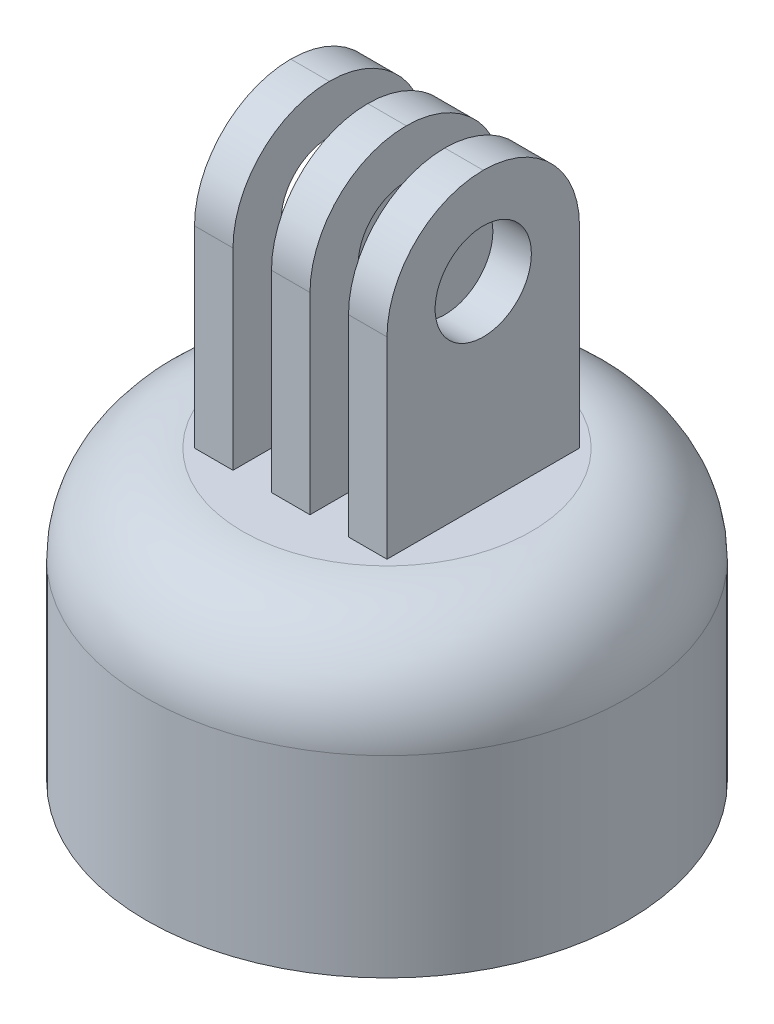
ISO-10303-21;
HEADER;
FILE_DESCRIPTION(('STEP AP214'),'2;1');
FILE_NAME('part.step','',(''),(''),'','','');
FILE_SCHEMA(('AUTOMOTIVE_DESIGN { 1 0 10303 214 1 1 1 1 }'));
ENDSEC;
DATA;
#1=APPLICATION_CONTEXT('core data for automotive mechanical design processes');
#2=APPLICATION_PROTOCOL_DEFINITION('international standard','automotive_design',2000,#1);
#3=PRODUCT_CONTEXT('',#1,'mechanical');
#4=PRODUCT('Part','Part','',(#3));
#5=PRODUCT_RELATED_PRODUCT_CATEGORY('part','',(#4));
#6=PRODUCT_DEFINITION_FORMATION('','',#4);
#7=PRODUCT_DEFINITION_CONTEXT('part definition',#1,'design');
#8=PRODUCT_DEFINITION('design','',#6,#7);
#9=PRODUCT_DEFINITION_SHAPE('','',#8);
#10=(LENGTH_UNIT() NAMED_UNIT(*) SI_UNIT(.MILLI.,.METRE.));
#11=(NAMED_UNIT(*) PLANE_ANGLE_UNIT() SI_UNIT($,.RADIAN.));
#12=(NAMED_UNIT(*) SI_UNIT($,.STERADIAN.) SOLID_ANGLE_UNIT());
#13=UNCERTAINTY_MEASURE_WITH_UNIT(LENGTH_MEASURE(1.E-05),#10,'distance_accuracy_value','');
#14=(GEOMETRIC_REPRESENTATION_CONTEXT(3) GLOBAL_UNCERTAINTY_ASSIGNED_CONTEXT((#13)) GLOBAL_UNIT_ASSIGNED_CONTEXT((#10,
#11,#12)) REPRESENTATION_CONTEXT('',''));
#15=CARTESIAN_POINT('',(0.,0.,0.));
#16=DIRECTION('',(0.,0.,1.));
#17=DIRECTION('',(1.,0.,0.));
#18=AXIS2_PLACEMENT_3D('',#15,#16,#17);
#19=CARTESIAN_POINT('',(0.,15.,0.));
#20=DIRECTION('',(0.,1.,0.));
#21=DIRECTION('',(0.,0.,1.));
#22=AXIS2_PLACEMENT_3D('',#19,#20,#21);
#23=PLANE('',#22);
#24=CARTESIAN_POINT('',(0.,15.,0.));
#25=DIRECTION('',(0.,1.,0.));
#26=DIRECTION('',(0.,0.,1.));
#27=AXIS2_PLACEMENT_3D('',#24,#25,#26);
#28=CIRCLE('',#27,7.5);
#29=CARTESIAN_POINT('',(0.,15.,7.5));
#30=VERTEX_POINT('',#29);
#31=EDGE_CURVE('E223',#30,#30,#28,.T.);
#32=ORIENTED_EDGE('',*,*,#31,.T.);
#33=EDGE_LOOP('',(#32));
#34=FACE_BOUND('',#33,.T.);
#35=DIRECTION('',(0.,0.,1.));
#36=VECTOR('',#35,1.);
#37=CARTESIAN_POINT('',(-1.,15.,5.));
#38=LINE('',#37,#36);
#39=CARTESIAN_POINT('',(-1.,15.,-5.));
#40=VERTEX_POINT('',#39);
#41=CARTESIAN_POINT('',(-1.,15.,5.));
#42=VERTEX_POINT('',#41);
#43=EDGE_CURVE('E194',#40,#42,#38,.T.);
#44=ORIENTED_EDGE('',*,*,#43,.F.);
#45=DIRECTION('',(-1.,0.,0.));
#46=VECTOR('',#45,1.);
#47=CARTESIAN_POINT('',(1.,15.,-5.));
#48=LINE('',#47,#46);
#49=CARTESIAN_POINT('',(1.,15.,-5.));
#50=VERTEX_POINT('',#49);
#51=EDGE_CURVE('E203',#50,#40,#48,.T.);
#52=ORIENTED_EDGE('',*,*,#51,.F.);
#53=DIRECTION('',(0.,0.,-1.));
#54=VECTOR('',#53,1.);
#55=CARTESIAN_POINT('',(1.,15.,5.));
#56=LINE('',#55,#54);
#57=CARTESIAN_POINT('',(1.,15.,5.));
#58=VERTEX_POINT('',#57);
#59=EDGE_CURVE('E200',#58,#50,#56,.T.);
#60=ORIENTED_EDGE('',*,*,#59,.F.);
#61=DIRECTION('',(1.,0.,0.));
#62=VECTOR('',#61,1.);
#63=CARTESIAN_POINT('',(1.,15.,5.));
#64=LINE('',#63,#62);
#65=EDGE_CURVE('E197',#42,#58,#64,.T.);
#66=ORIENTED_EDGE('',*,*,#65,.F.);
#67=EDGE_LOOP('',(#44,#52,#60,#66));
#68=FACE_BOUND('',#67,.T.);
#69=DIRECTION('',(1.,0.,0.));
#70=VECTOR('',#69,1.);
#71=CARTESIAN_POINT('',(5.,15.,5.));
#72=LINE('',#71,#70);
#73=CARTESIAN_POINT('',(3.,15.,5.));
#74=VERTEX_POINT('',#73);
#75=CARTESIAN_POINT('',(5.,15.,5.));
#76=VERTEX_POINT('',#75);
#77=EDGE_CURVE('E177',#74,#76,#72,.T.);
#78=ORIENTED_EDGE('',*,*,#77,.F.);
#79=DIRECTION('',(0.,0.,1.));
#80=VECTOR('',#79,1.);
#81=CARTESIAN_POINT('',(3.,15.,5.));
#82=LINE('',#81,#80);
#83=CARTESIAN_POINT('',(3.,15.,-5.));
#84=VERTEX_POINT('',#83);
#85=EDGE_CURVE('E150',#84,#74,#82,.T.);
#86=ORIENTED_EDGE('',*,*,#85,.F.);
#87=DIRECTION('',(-1.,0.,0.));
#88=VECTOR('',#87,1.);
#89=CARTESIAN_POINT('',(5.,15.,-5.));
#90=LINE('',#89,#88);
#91=CARTESIAN_POINT('',(5.,15.,-5.));
#92=VERTEX_POINT('',#91);
#93=EDGE_CURVE('E183',#92,#84,#90,.T.);
#94=ORIENTED_EDGE('',*,*,#93,.F.);
#95=DIRECTION('',(0.,0.,-1.));
#96=VECTOR('',#95,1.);
#97=CARTESIAN_POINT('',(5.,15.,5.));
#98=LINE('',#97,#96);
#99=EDGE_CURVE('E180',#76,#92,#98,.T.);
#100=ORIENTED_EDGE('',*,*,#99,.F.);
#101=EDGE_LOOP('',(#78,#86,#94,#100));
#102=FACE_BOUND('',#101,.T.);
#103=DIRECTION('',(1.,0.,0.));
#104=VECTOR('',#103,1.);
#105=CARTESIAN_POINT('',(-3.,15.,5.00000000000003));
#106=LINE('',#105,#104);
#107=CARTESIAN_POINT('',(-5.,15.,5.00000000000003));
#108=VERTEX_POINT('',#107);
#109=CARTESIAN_POINT('',(-3.,15.,5.00000000000003));
#110=VERTEX_POINT('',#109);
#111=EDGE_CURVE('E144',#108,#110,#106,.T.);
#112=ORIENTED_EDGE('',*,*,#111,.F.);
#113=DIRECTION('',(0.,0.,1.));
#114=VECTOR('',#113,1.);
#115=CARTESIAN_POINT('',(-5.,15.,5.00000000000003));
#116=LINE('',#115,#114);
#117=CARTESIAN_POINT('',(-5.,15.,-4.99999999999997));
#118=VERTEX_POINT('',#117);
#119=EDGE_CURVE('E154',#118,#108,#116,.T.);
#120=ORIENTED_EDGE('',*,*,#119,.F.);
#121=DIRECTION('',(-1.,0.,0.));
#122=VECTOR('',#121,1.);
#123=CARTESIAN_POINT('',(-3.,15.,-4.99999999999997));
#124=LINE('',#123,#122);
#125=CARTESIAN_POINT('',(-3.,15.,-4.99999999999997));
#126=VERTEX_POINT('',#125);
#127=EDGE_CURVE('E166',#126,#118,#124,.T.);
#128=ORIENTED_EDGE('',*,*,#127,.F.);
#129=DIRECTION('',(0.,0.,-1.));
#130=VECTOR('',#129,1.);
#131=CARTESIAN_POINT('',(-3.,15.,5.00000000000003));
#132=LINE('',#131,#130);
#133=EDGE_CURVE('E164',#110,#126,#132,.T.);
#134=ORIENTED_EDGE('',*,*,#133,.F.);
#135=EDGE_LOOP('',(#112,#120,#128,#134));
#136=FACE_BOUND('',#135,.T.);
#137=ADVANCED_FACE('F33',(#34,#68,#102,#136),#23,.T.);
#138=CARTESIAN_POINT('',(0.,0.,0.));
#139=DIRECTION('',(0.,1.,0.));
#140=DIRECTION('',(0.,0.,1.));
#141=AXIS2_PLACEMENT_3D('',#138,#139,#140);
#142=PLANE('',#141);
#143=CARTESIAN_POINT('',(0.,0.,0.));
#144=DIRECTION('',(0.,1.,0.));
#145=DIRECTION('',(0.,0.,1.));
#146=AXIS2_PLACEMENT_3D('',#143,#144,#145);
#147=CIRCLE('',#146,12.5);
#148=CARTESIAN_POINT('',(0.,0.,12.5));
#149=VERTEX_POINT('',#148);
#150=EDGE_CURVE('E220',#149,#149,#147,.T.);
#151=ORIENTED_EDGE('',*,*,#150,.F.);
#152=EDGE_LOOP('',(#151));
#153=FACE_BOUND('',#152,.T.);
#154=CARTESIAN_POINT('',(0.,0.,0.));
#155=DIRECTION('',(0.,1.,0.));
#156=DIRECTION('',(0.,0.,1.));
#157=AXIS2_PLACEMENT_3D('',#154,#155,#156);
#158=CIRCLE('',#157,10.5);
#159=CARTESIAN_POINT('',(0.,0.,10.5));
#160=VERTEX_POINT('',#159);
#161=EDGE_CURVE('E217',#160,#160,#158,.T.);
#162=ORIENTED_EDGE('',*,*,#161,.T.);
#163=EDGE_LOOP('',(#162));
#164=FACE_BOUND('',#163,.T.);
#165=ADVANCED_FACE('F316',(#153,#164),#142,.F.);
#166=CARTESIAN_POINT('',(0.,10.,0.));
#167=DIRECTION('',(0.,-1.,0.));
#168=DIRECTION('',(0.,0.,-1.));
#169=AXIS2_PLACEMENT_3D('',#166,#167,#168);
#170=CYLINDRICAL_SURFACE('',#169,12.5);
#171=CARTESIAN_POINT('',(0.,10.,0.));
#172=DIRECTION('',(0.,1.,0.));
#173=DIRECTION('',(0.,0.,1.));
#174=AXIS2_PLACEMENT_3D('',#171,#172,#173);
#175=CIRCLE('',#174,12.5);
#176=CARTESIAN_POINT('',(0.,10.,12.5));
#177=VERTEX_POINT('',#176);
#178=EDGE_CURVE('E226',#177,#177,#175,.F.);
#179=ORIENTED_EDGE('',*,*,#178,.T.);
#180=EDGE_LOOP('',(#179));
#181=FACE_BOUND('',#180,.T.);
#182=ORIENTED_EDGE('',*,*,#150,.T.);
#183=EDGE_LOOP('',(#182));
#184=FACE_BOUND('',#183,.T.);
#185=ADVANCED_FACE('F322',(#181,#184),#170,.T.);
#186=CARTESIAN_POINT('',(0.,10.,0.));
#187=DIRECTION('',(0.,-1.,0.));
#188=DIRECTION('',(0.,0.,-1.));
#189=AXIS2_PLACEMENT_3D('',#186,#187,#188);
#190=CYLINDRICAL_SURFACE('',#189,10.5);
#191=CARTESIAN_POINT('',(0.,10.,0.));
#192=DIRECTION('',(0.,1.,0.));
#193=DIRECTION('',(0.,0.,1.));
#194=AXIS2_PLACEMENT_3D('',#191,#192,#193);
#195=CIRCLE('',#194,10.5);
#196=CARTESIAN_POINT('',(0.,10.,10.5));
#197=VERTEX_POINT('',#196);
#198=EDGE_CURVE('E214',#197,#197,#195,.T.);
#199=ORIENTED_EDGE('',*,*,#198,.T.);
#200=EDGE_LOOP('',(#199));
#201=FACE_BOUND('',#200,.T.);
#202=ORIENTED_EDGE('',*,*,#161,.F.);
#203=EDGE_LOOP('',(#202));
#204=FACE_BOUND('',#203,.T.);
#205=ADVANCED_FACE('F333',(#201,#204),#190,.F.);
#206=CARTESIAN_POINT('',(0.,10.,0.));
#207=DIRECTION('',(0.,1.,0.));
#208=DIRECTION('',(0.,0.,1.));
#209=AXIS2_PLACEMENT_3D('',#206,#207,#208);
#210=PLANE('',#209);
#211=ORIENTED_EDGE('',*,*,#198,.F.);
#212=EDGE_LOOP('',(#211));
#213=FACE_BOUND('',#212,.T.);
#214=ADVANCED_FACE('F330',(#213),#210,.F.);
#215=CARTESIAN_POINT('',(-1.,30.,5.));
#216=DIRECTION('',(1.,0.,0.));
#217=DIRECTION('',(0.,0.,-1.));
#218=AXIS2_PLACEMENT_3D('',#215,#216,#217);
#219=PLANE('',#218);
#220=CARTESIAN_POINT('',(-1.,25.,0.));
#221=DIRECTION('',(1.,0.,0.));
#222=DIRECTION('',(0.,0.,-1.));
#223=AXIS2_PLACEMENT_3D('',#220,#221,#222);
#224=CIRCLE('',#223,2.5);
#225=CARTESIAN_POINT('',(-1.,25.,-2.5));
#226=VERTEX_POINT('',#225);
#227=EDGE_CURVE('E268',#226,#226,#224,.T.);
#228=ORIENTED_EDGE('',*,*,#227,.T.);
#229=EDGE_LOOP('',(#228));
#230=FACE_BOUND('',#229,.T.);
#231=CARTESIAN_POINT('',(-1.,25.,0.));
#232=DIRECTION('',(1.,0.,0.));
#233=DIRECTION('',(0.,0.,-1.));
#234=AXIS2_PLACEMENT_3D('',#231,#232,#233);
#235=CIRCLE('',#234,5.);
#236=CARTESIAN_POINT('',(-1.,25.,5.));
#237=VERTEX_POINT('',#236);
#238=CARTESIAN_POINT('',(-1.,30.,0.));
#239=VERTEX_POINT('',#238);
#240=EDGE_CURVE('E240',#237,#239,#235,.F.);
#241=ORIENTED_EDGE('',*,*,#240,.T.);
#242=CARTESIAN_POINT('',(-1.,25.,0.));
#243=DIRECTION('',(1.,0.,0.));
#244=DIRECTION('',(0.,0.,-1.));
#245=AXIS2_PLACEMENT_3D('',#242,#243,#244);
#246=CIRCLE('',#245,5.);
#247=CARTESIAN_POINT('',(-1.,25.,-5.));
#248=VERTEX_POINT('',#247);
#249=EDGE_CURVE('E242',#239,#248,#246,.F.);
#250=ORIENTED_EDGE('',*,*,#249,.T.);
#251=DIRECTION('',(0.,-1.,0.));
#252=VECTOR('',#251,1.);
#253=CARTESIAN_POINT('',(-1.,30.,-5.));
#254=LINE('',#253,#252);
#255=EDGE_CURVE('E206',#248,#40,#254,.T.);
#256=ORIENTED_EDGE('',*,*,#255,.T.);
#257=ORIENTED_EDGE('',*,*,#43,.T.);
#258=DIRECTION('',(0.,-1.,0.));
#259=VECTOR('',#258,1.);
#260=CARTESIAN_POINT('',(-1.,30.,5.));
#261=LINE('',#260,#259);
#262=EDGE_CURVE('E212',#237,#42,#261,.T.);
#263=ORIENTED_EDGE('',*,*,#262,.F.);
#264=EDGE_LOOP('',(#241,#250,#256,#257,#263));
#265=FACE_BOUND('',#264,.T.);
#266=ADVANCED_FACE('F328',(#230,#265),#219,.F.);
#267=CARTESIAN_POINT('',(1.,30.,5.));
#268=DIRECTION('',(0.,0.,-1.));
#269=DIRECTION('',(-1.,0.,0.));
#270=AXIS2_PLACEMENT_3D('',#267,#268,#269);
#271=PLANE('',#270);
#272=DIRECTION('',(0.,-1.,0.));
#273=VECTOR('',#272,1.);
#274=CARTESIAN_POINT('',(1.,30.,5.));
#275=LINE('',#274,#273);
#276=CARTESIAN_POINT('',(1.,25.,5.));
#277=VERTEX_POINT('',#276);
#278=EDGE_CURVE('E210',#277,#58,#275,.T.);
#279=ORIENTED_EDGE('',*,*,#278,.F.);
#280=DIRECTION('',(1.,0.,0.));
#281=VECTOR('',#280,1.);
#282=CARTESIAN_POINT('',(-1.,25.,5.));
#283=LINE('',#282,#281);
#284=EDGE_CURVE('E42',#277,#237,#283,.F.);
#285=ORIENTED_EDGE('',*,*,#284,.T.);
#286=ORIENTED_EDGE('',*,*,#262,.T.);
#287=ORIENTED_EDGE('',*,*,#65,.T.);
#288=EDGE_LOOP('',(#279,#285,#286,#287));
#289=FACE_BOUND('',#288,.T.);
#290=ADVANCED_FACE('F397',(#289),#271,.F.);
#291=CARTESIAN_POINT('',(1.,30.,5.));
#292=DIRECTION('',(-1.,0.,0.));
#293=DIRECTION('',(0.,0.,1.));
#294=AXIS2_PLACEMENT_3D('',#291,#292,#293);
#295=PLANE('',#294);
#296=CARTESIAN_POINT('',(0.999999999999999,25.,0.));
#297=DIRECTION('',(-1.,0.,0.));
#298=DIRECTION('',(0.,0.,1.));
#299=AXIS2_PLACEMENT_3D('',#296,#297,#298);
#300=CIRCLE('',#299,2.5);
#301=CARTESIAN_POINT('',(0.999999999999999,25.,2.5));
#302=VERTEX_POINT('',#301);
#303=EDGE_CURVE('E273',#302,#302,#300,.T.);
#304=ORIENTED_EDGE('',*,*,#303,.T.);
#305=EDGE_LOOP('',(#304));
#306=FACE_BOUND('',#305,.T.);
#307=DIRECTION('',(0.,-1.,0.));
#308=VECTOR('',#307,1.);
#309=CARTESIAN_POINT('',(1.,30.,-5.));
#310=LINE('',#309,#308);
#311=CARTESIAN_POINT('',(1.,25.,-5.));
#312=VERTEX_POINT('',#311);
#313=EDGE_CURVE('E208',#312,#50,#310,.T.);
#314=ORIENTED_EDGE('',*,*,#313,.F.);
#315=CARTESIAN_POINT('',(1.,25.,0.));
#316=DIRECTION('',(-1.,0.,0.));
#317=DIRECTION('',(0.,0.,1.));
#318=AXIS2_PLACEMENT_3D('',#315,#316,#317);
#319=CIRCLE('',#318,5.);
#320=CARTESIAN_POINT('',(1.,30.,0.));
#321=VERTEX_POINT('',#320);
#322=EDGE_CURVE('E249',#312,#321,#319,.F.);
#323=ORIENTED_EDGE('',*,*,#322,.T.);
#324=CARTESIAN_POINT('',(1.,25.,0.));
#325=DIRECTION('',(-1.,0.,0.));
#326=DIRECTION('',(0.,0.,1.));
#327=AXIS2_PLACEMENT_3D('',#324,#325,#326);
#328=CIRCLE('',#327,5.);
#329=EDGE_CURVE('E247',#321,#277,#328,.F.);
#330=ORIENTED_EDGE('',*,*,#329,.T.);
#331=ORIENTED_EDGE('',*,*,#278,.T.);
#332=ORIENTED_EDGE('',*,*,#59,.T.);
#333=EDGE_LOOP('',(#314,#323,#330,#331,#332));
#334=FACE_BOUND('',#333,.T.);
#335=ADVANCED_FACE('F394',(#306,#334),#295,.F.);
#336=CARTESIAN_POINT('',(1.,30.,-5.));
#337=DIRECTION('',(0.,0.,1.));
#338=DIRECTION('',(1.,0.,0.));
#339=AXIS2_PLACEMENT_3D('',#336,#337,#338);
#340=PLANE('',#339);
#341=ORIENTED_EDGE('',*,*,#255,.F.);
#342=DIRECTION('',(-1.,0.,0.));
#343=VECTOR('',#342,1.);
#344=CARTESIAN_POINT('',(1.,25.,-5.));
#345=LINE('',#344,#343);
#346=EDGE_CURVE('E244',#248,#312,#345,.F.);
#347=ORIENTED_EDGE('',*,*,#346,.T.);
#348=ORIENTED_EDGE('',*,*,#313,.T.);
#349=ORIENTED_EDGE('',*,*,#51,.T.);
#350=EDGE_LOOP('',(#341,#347,#348,#349));
#351=FACE_BOUND('',#350,.T.);
#352=ADVANCED_FACE('F388',(#351),#340,.F.);
#353=CARTESIAN_POINT('',(3.,30.,5.));
#354=DIRECTION('',(1.,0.,0.));
#355=DIRECTION('',(0.,0.,-1.));
#356=AXIS2_PLACEMENT_3D('',#353,#354,#355);
#357=PLANE('',#356);
#358=CARTESIAN_POINT('',(3.,25.,0.));
#359=DIRECTION('',(1.,0.,0.));
#360=DIRECTION('',(0.,0.,-1.));
#361=AXIS2_PLACEMENT_3D('',#358,#359,#360);
#362=CIRCLE('',#361,2.5);
#363=CARTESIAN_POINT('',(3.,25.,-2.5));
#364=VERTEX_POINT('',#363);
#365=EDGE_CURVE('E277',#364,#364,#362,.T.);
#366=ORIENTED_EDGE('',*,*,#365,.T.);
#367=EDGE_LOOP('',(#366));
#368=FACE_BOUND('',#367,.T.);
#369=CARTESIAN_POINT('',(3.,25.,0.));
#370=DIRECTION('',(1.,0.,0.));
#371=DIRECTION('',(0.,0.,-1.));
#372=AXIS2_PLACEMENT_3D('',#369,#370,#371);
#373=CIRCLE('',#372,5.);
#374=CARTESIAN_POINT('',(3.,25.,5.));
#375=VERTEX_POINT('',#374);
#376=CARTESIAN_POINT('',(3.,30.,0.));
#377=VERTEX_POINT('',#376);
#378=EDGE_CURVE('E251',#375,#377,#373,.F.);
#379=ORIENTED_EDGE('',*,*,#378,.T.);
#380=CARTESIAN_POINT('',(3.,25.,0.));
#381=DIRECTION('',(1.,0.,0.));
#382=DIRECTION('',(0.,0.,-1.));
#383=AXIS2_PLACEMENT_3D('',#380,#381,#382);
#384=CIRCLE('',#383,5.);
#385=CARTESIAN_POINT('',(3.,25.,-5.));
#386=VERTEX_POINT('',#385);
#387=EDGE_CURVE('E253',#377,#386,#384,.F.);
#388=ORIENTED_EDGE('',*,*,#387,.T.);
#389=DIRECTION('',(0.,-1.,0.));
#390=VECTOR('',#389,1.);
#391=CARTESIAN_POINT('',(3.,30.,-5.));
#392=LINE('',#391,#390);
#393=EDGE_CURVE('E186',#386,#84,#392,.T.);
#394=ORIENTED_EDGE('',*,*,#393,.T.);
#395=ORIENTED_EDGE('',*,*,#85,.T.);
#396=DIRECTION('',(0.,-1.,0.));
#397=VECTOR('',#396,1.);
#398=CARTESIAN_POINT('',(3.,30.,5.));
#399=LINE('',#398,#397);
#400=EDGE_CURVE('E192',#375,#74,#399,.T.);
#401=ORIENTED_EDGE('',*,*,#400,.F.);
#402=EDGE_LOOP('',(#379,#388,#394,#395,#401));
#403=FACE_BOUND('',#402,.T.);
#404=ADVANCED_FACE('F375',(#368,#403),#357,.F.);
#405=CARTESIAN_POINT('',(5.,30.,5.));
#406=DIRECTION('',(0.,0.,-1.));
#407=DIRECTION('',(-1.,0.,0.));
#408=AXIS2_PLACEMENT_3D('',#405,#406,#407);
#409=PLANE('',#408);
#410=DIRECTION('',(0.,-1.,0.));
#411=VECTOR('',#410,1.);
#412=CARTESIAN_POINT('',(5.,30.,5.));
#413=LINE('',#412,#411);
#414=CARTESIAN_POINT('',(5.,25.,5.));
#415=VERTEX_POINT('',#414);
#416=EDGE_CURVE('E190',#415,#76,#413,.T.);
#417=ORIENTED_EDGE('',*,*,#416,.F.);
#418=DIRECTION('',(1.,0.,0.));
#419=VECTOR('',#418,1.);
#420=CARTESIAN_POINT('',(3.,25.,5.));
#421=LINE('',#420,#419);
#422=EDGE_CURVE('E11',#415,#375,#421,.F.);
#423=ORIENTED_EDGE('',*,*,#422,.T.);
#424=ORIENTED_EDGE('',*,*,#400,.T.);
#425=ORIENTED_EDGE('',*,*,#77,.T.);
#426=EDGE_LOOP('',(#417,#423,#424,#425));
#427=FACE_BOUND('',#426,.T.);
#428=ADVANCED_FACE('F379',(#427),#409,.F.);
#429=CARTESIAN_POINT('',(5.,30.,5.));
#430=DIRECTION('',(-1.,0.,0.));
#431=DIRECTION('',(0.,0.,1.));
#432=AXIS2_PLACEMENT_3D('',#429,#430,#431);
#433=PLANE('',#432);
#434=CARTESIAN_POINT('',(5.,25.,0.));
#435=DIRECTION('',(1.,0.,0.));
#436=DIRECTION('',(0.,0.,-1.));
#437=AXIS2_PLACEMENT_3D('',#434,#435,#436);
#438=CIRCLE('',#437,2.5);
#439=CARTESIAN_POINT('',(5.,25.,-2.5));
#440=VERTEX_POINT('',#439);
#441=EDGE_CURVE('E285',#440,#440,#438,.T.);
#442=ORIENTED_EDGE('',*,*,#441,.F.);
#443=EDGE_LOOP('',(#442));
#444=FACE_BOUND('',#443,.T.);
#445=DIRECTION('',(0.,-1.,0.));
#446=VECTOR('',#445,1.);
#447=CARTESIAN_POINT('',(5.,30.,-5.));
#448=LINE('',#447,#446);
#449=CARTESIAN_POINT('',(5.,25.,-5.));
#450=VERTEX_POINT('',#449);
#451=EDGE_CURVE('E188',#450,#92,#448,.T.);
#452=ORIENTED_EDGE('',*,*,#451,.F.);
#453=CARTESIAN_POINT('',(5.,25.,0.));
#454=DIRECTION('',(-1.,0.,0.));
#455=DIRECTION('',(0.,0.,1.));
#456=AXIS2_PLACEMENT_3D('',#453,#454,#455);
#457=CIRCLE('',#456,5.);
#458=CARTESIAN_POINT('',(5.,30.,0.));
#459=VERTEX_POINT('',#458);
#460=EDGE_CURVE('E55',#450,#459,#457,.F.);
#461=ORIENTED_EDGE('',*,*,#460,.T.);
#462=CARTESIAN_POINT('',(5.,25.,0.));
#463=DIRECTION('',(-1.,0.,0.));
#464=DIRECTION('',(0.,0.,1.));
#465=AXIS2_PLACEMENT_3D('',#462,#463,#464);
#466=CIRCLE('',#465,5.);
#467=EDGE_CURVE('E50',#459,#415,#466,.F.);
#468=ORIENTED_EDGE('',*,*,#467,.T.);
#469=ORIENTED_EDGE('',*,*,#416,.T.);
#470=ORIENTED_EDGE('',*,*,#99,.T.);
#471=EDGE_LOOP('',(#452,#461,#468,#469,#470));
#472=FACE_BOUND('',#471,.T.);
#473=ADVANCED_FACE('F312',(#444,#472),#433,.F.);
#474=CARTESIAN_POINT('',(5.,30.,-5.));
#475=DIRECTION('',(0.,0.,1.));
#476=DIRECTION('',(1.,0.,0.));
#477=AXIS2_PLACEMENT_3D('',#474,#475,#476);
#478=PLANE('',#477);
#479=ORIENTED_EDGE('',*,*,#393,.F.);
#480=DIRECTION('',(-1.,0.,0.));
#481=VECTOR('',#480,1.);
#482=CARTESIAN_POINT('',(5.,25.,-5.));
#483=LINE('',#482,#481);
#484=EDGE_CURVE('E255',#386,#450,#483,.F.);
#485=ORIENTED_EDGE('',*,*,#484,.T.);
#486=ORIENTED_EDGE('',*,*,#451,.T.);
#487=ORIENTED_EDGE('',*,*,#93,.T.);
#488=EDGE_LOOP('',(#479,#485,#486,#487));
#489=FACE_BOUND('',#488,.T.);
#490=ADVANCED_FACE('F305',(#489),#478,.F.);
#491=CARTESIAN_POINT('',(-5.,30.,5.00000000000003));
#492=DIRECTION('',(1.,0.,0.));
#493=DIRECTION('',(0.,0.,-1.));
#494=AXIS2_PLACEMENT_3D('',#491,#492,#493);
#495=PLANE('',#494);
#496=CARTESIAN_POINT('',(-5.,25.,0.));
#497=DIRECTION('',(1.,0.,0.));
#498=DIRECTION('',(0.,0.,-1.));
#499=AXIS2_PLACEMENT_3D('',#496,#497,#498);
#500=CIRCLE('',#499,2.5);
#501=CARTESIAN_POINT('',(-5.,25.,-2.5));
#502=VERTEX_POINT('',#501);
#503=EDGE_CURVE('E282',#502,#502,#500,.T.);
#504=ORIENTED_EDGE('',*,*,#503,.T.);
#505=EDGE_LOOP('',(#504));
#506=FACE_BOUND('',#505,.T.);
#507=CARTESIAN_POINT('',(-5.,25.,0.));
#508=DIRECTION('',(1.,0.,0.));
#509=DIRECTION('',(0.,0.,-1.));
#510=AXIS2_PLACEMENT_3D('',#507,#508,#509);
#511=CIRCLE('',#510,5.);
#512=CARTESIAN_POINT('',(-5.,25.,5.00000000000003));
#513=VERTEX_POINT('',#512);
#514=CARTESIAN_POINT('',(-5.,30.,0.));
#515=VERTEX_POINT('',#514);
#516=EDGE_CURVE('E229',#513,#515,#511,.F.);
#517=ORIENTED_EDGE('',*,*,#516,.T.);
#518=CARTESIAN_POINT('',(-5.,25.,0.));
#519=DIRECTION('',(1.,0.,0.));
#520=DIRECTION('',(0.,0.,-1.));
#521=AXIS2_PLACEMENT_3D('',#518,#519,#520);
#522=CIRCLE('',#521,5.);
#523=CARTESIAN_POINT('',(-5.,25.,-4.99999999999997));
#524=VERTEX_POINT('',#523);
#525=EDGE_CURVE('E231',#515,#524,#522,.F.);
#526=ORIENTED_EDGE('',*,*,#525,.T.);
#527=DIRECTION('',(0.,-1.,0.));
#528=VECTOR('',#527,1.);
#529=CARTESIAN_POINT('',(-5.,30.,-4.99999999999997));
#530=LINE('',#529,#528);
#531=EDGE_CURVE('E157',#524,#118,#530,.T.);
#532=ORIENTED_EDGE('',*,*,#531,.T.);
#533=ORIENTED_EDGE('',*,*,#119,.T.);
#534=DIRECTION('',(0.,-1.,0.));
#535=VECTOR('',#534,1.);
#536=CARTESIAN_POINT('',(-5.,30.,5.00000000000003));
#537=LINE('',#536,#535);
#538=EDGE_CURVE('E139',#513,#108,#537,.T.);
#539=ORIENTED_EDGE('',*,*,#538,.F.);
#540=EDGE_LOOP('',(#517,#526,#532,#533,#539));
#541=FACE_BOUND('',#540,.T.);
#542=ADVANCED_FACE('F155',(#506,#541),#495,.F.);
#543=CARTESIAN_POINT('',(-3.,30.,5.00000000000003));
#544=DIRECTION('',(0.,0.,-1.));
#545=DIRECTION('',(-1.,0.,0.));
#546=AXIS2_PLACEMENT_3D('',#543,#544,#545);
#547=PLANE('',#546);
#548=DIRECTION('',(0.,-1.,0.));
#549=VECTOR('',#548,1.);
#550=CARTESIAN_POINT('',(-3.,30.,5.00000000000003));
#551=LINE('',#550,#549);
#552=CARTESIAN_POINT('',(-3.,25.,5.00000000000003));
#553=VERTEX_POINT('',#552);
#554=EDGE_CURVE('E151',#553,#110,#551,.T.);
#555=ORIENTED_EDGE('',*,*,#554,.F.);
#556=DIRECTION('',(1.,0.,0.));
#557=VECTOR('',#556,1.);
#558=CARTESIAN_POINT('',(-5.,25.,5.00000000000003));
#559=LINE('',#558,#557);
#560=EDGE_CURVE('E147',#553,#513,#559,.F.);
#561=ORIENTED_EDGE('',*,*,#560,.T.);
#562=ORIENTED_EDGE('',*,*,#538,.T.);
#563=ORIENTED_EDGE('',*,*,#111,.T.);
#564=EDGE_LOOP('',(#555,#561,#562,#563));
#565=FACE_BOUND('',#564,.T.);
#566=ADVANCED_FACE('F142',(#565),#547,.F.);
#567=CARTESIAN_POINT('',(-3.,30.,5.00000000000003));
#568=DIRECTION('',(-1.,0.,0.));
#569=DIRECTION('',(0.,0.,1.));
#570=AXIS2_PLACEMENT_3D('',#567,#568,#569);
#571=PLANE('',#570);
#572=CARTESIAN_POINT('',(-3.,25.,0.));
#573=DIRECTION('',(-1.,0.,0.));
#574=DIRECTION('',(0.,0.,1.));
#575=AXIS2_PLACEMENT_3D('',#572,#573,#574);
#576=CIRCLE('',#575,2.5);
#577=CARTESIAN_POINT('',(-3.,25.,2.5));
#578=VERTEX_POINT('',#577);
#579=EDGE_CURVE('E37',#578,#578,#576,.T.);
#580=ORIENTED_EDGE('',*,*,#579,.T.);
#581=EDGE_LOOP('',(#580));
#582=FACE_BOUND('',#581,.T.);
#583=DIRECTION('',(0.,-1.,0.));
#584=VECTOR('',#583,1.);
#585=CARTESIAN_POINT('',(-3.,30.,-4.99999999999997));
#586=LINE('',#585,#584);
#587=CARTESIAN_POINT('',(-3.,25.,-4.99999999999997));
#588=VERTEX_POINT('',#587);
#589=EDGE_CURVE('E172',#588,#126,#586,.T.);
#590=ORIENTED_EDGE('',*,*,#589,.F.);
#591=CARTESIAN_POINT('',(-3.,25.,0.));
#592=DIRECTION('',(-1.,0.,0.));
#593=DIRECTION('',(0.,0.,1.));
#594=AXIS2_PLACEMENT_3D('',#591,#592,#593);
#595=CIRCLE('',#594,5.);
#596=CARTESIAN_POINT('',(-3.,30.,0.));
#597=VERTEX_POINT('',#596);
#598=EDGE_CURVE('E238',#588,#597,#595,.F.);
#599=ORIENTED_EDGE('',*,*,#598,.T.);
#600=CARTESIAN_POINT('',(-3.,25.,0.));
#601=DIRECTION('',(-1.,0.,0.));
#602=DIRECTION('',(0.,0.,1.));
#603=AXIS2_PLACEMENT_3D('',#600,#601,#602);
#604=CIRCLE('',#603,5.);
#605=EDGE_CURVE('E236',#597,#553,#604,.F.);
#606=ORIENTED_EDGE('',*,*,#605,.T.);
#607=ORIENTED_EDGE('',*,*,#554,.T.);
#608=ORIENTED_EDGE('',*,*,#133,.T.);
#609=EDGE_LOOP('',(#590,#599,#606,#607,#608));
#610=FACE_BOUND('',#609,.T.);
#611=ADVANCED_FACE('F292',(#582,#610),#571,.F.);
#612=CARTESIAN_POINT('',(-3.,30.,-4.99999999999997));
#613=DIRECTION('',(0.,0.,1.));
#614=DIRECTION('',(1.,0.,0.));
#615=AXIS2_PLACEMENT_3D('',#612,#613,#614);
#616=PLANE('',#615);
#617=ORIENTED_EDGE('',*,*,#531,.F.);
#618=DIRECTION('',(-1.,0.,0.));
#619=VECTOR('',#618,1.);
#620=CARTESIAN_POINT('',(-3.,25.,-4.99999999999997));
#621=LINE('',#620,#619);
#622=EDGE_CURVE('E233',#524,#588,#621,.F.);
#623=ORIENTED_EDGE('',*,*,#622,.T.);
#624=ORIENTED_EDGE('',*,*,#589,.T.);
#625=ORIENTED_EDGE('',*,*,#127,.T.);
#626=EDGE_LOOP('',(#617,#623,#624,#625));
#627=FACE_BOUND('',#626,.T.);
#628=ADVANCED_FACE('F345',(#627),#616,.F.);
#629=CARTESIAN_POINT('',(0.,10.,0.));
#630=DIRECTION('',(0.,1.,0.));
#631=DIRECTION('',(0.,0.,1.));
#632=AXIS2_PLACEMENT_3D('',#629,#630,#631);
#633=TOROIDAL_SURFACE('',#632,7.5,5.);
#634=ORIENTED_EDGE('',*,*,#178,.F.);
#635=EDGE_LOOP('',(#634));
#636=FACE_BOUND('',#635,.T.);
#637=ORIENTED_EDGE('',*,*,#31,.F.);
#638=EDGE_LOOP('',(#637));
#639=FACE_BOUND('',#638,.T.);
#640=ADVANCED_FACE('F341',(#636,#639),#633,.T.);
#641=CARTESIAN_POINT('',(0.,25.,0.));
#642=DIRECTION('',(-1.,0.,0.));
#643=DIRECTION('',(0.,0.,1.));
#644=AXIS2_PLACEMENT_3D('',#641,#642,#643);
#645=CYLINDRICAL_SURFACE('',#644,5.);
#646=ORIENTED_EDGE('',*,*,#560,.F.);
#647=ORIENTED_EDGE('',*,*,#605,.F.);
#648=DIRECTION('',(1.,0.,0.));
#649=VECTOR('',#648,1.);
#650=CARTESIAN_POINT('',(-3.,30.,0.));
#651=LINE('',#650,#649);
#652=EDGE_CURVE('E161',#515,#597,#651,.T.);
#653=ORIENTED_EDGE('',*,*,#652,.F.);
#654=ORIENTED_EDGE('',*,*,#516,.F.);
#655=EDGE_LOOP('',(#646,#647,#653,#654));
#656=FACE_BOUND('',#655,.T.);
#657=ADVANCED_FACE('F344',(#656),#645,.T.);
#658=CARTESIAN_POINT('',(0.,25.,0.));
#659=DIRECTION('',(1.,0.,0.));
#660=DIRECTION('',(0.,0.,-1.));
#661=AXIS2_PLACEMENT_3D('',#658,#659,#660);
#662=CYLINDRICAL_SURFACE('',#661,5.);
#663=ORIENTED_EDGE('',*,*,#598,.F.);
#664=ORIENTED_EDGE('',*,*,#622,.F.);
#665=ORIENTED_EDGE('',*,*,#525,.F.);
#666=ORIENTED_EDGE('',*,*,#652,.T.);
#667=EDGE_LOOP('',(#663,#664,#665,#666));
#668=FACE_BOUND('',#667,.T.);
#669=ADVANCED_FACE('F347',(#668),#662,.T.);
#670=CARTESIAN_POINT('',(0.,25.,0.));
#671=DIRECTION('',(-1.,0.,0.));
#672=DIRECTION('',(0.,0.,1.));
#673=AXIS2_PLACEMENT_3D('',#670,#671,#672);
#674=CYLINDRICAL_SURFACE('',#673,5.);
#675=ORIENTED_EDGE('',*,*,#284,.F.);
#676=ORIENTED_EDGE('',*,*,#329,.F.);
#677=DIRECTION('',(1.,0.,0.));
#678=VECTOR('',#677,1.);
#679=CARTESIAN_POINT('',(1.,30.,0.));
#680=LINE('',#679,#678);
#681=EDGE_CURVE('E264',#239,#321,#680,.T.);
#682=ORIENTED_EDGE('',*,*,#681,.F.);
#683=ORIENTED_EDGE('',*,*,#240,.F.);
#684=EDGE_LOOP('',(#675,#676,#682,#683));
#685=FACE_BOUND('',#684,.T.);
#686=ADVANCED_FACE('F350',(#685),#674,.T.);
#687=CARTESIAN_POINT('',(0.,25.,0.));
#688=DIRECTION('',(1.,0.,0.));
#689=DIRECTION('',(0.,0.,-1.));
#690=AXIS2_PLACEMENT_3D('',#687,#688,#689);
#691=CYLINDRICAL_SURFACE('',#690,5.);
#692=ORIENTED_EDGE('',*,*,#322,.F.);
#693=ORIENTED_EDGE('',*,*,#346,.F.);
#694=ORIENTED_EDGE('',*,*,#249,.F.);
#695=ORIENTED_EDGE('',*,*,#681,.T.);
#696=EDGE_LOOP('',(#692,#693,#694,#695));
#697=FACE_BOUND('',#696,.T.);
#698=ADVANCED_FACE('F355',(#697),#691,.T.);
#699=CARTESIAN_POINT('',(0.,25.,0.));
#700=DIRECTION('',(-1.,0.,0.));
#701=DIRECTION('',(0.,0.,1.));
#702=AXIS2_PLACEMENT_3D('',#699,#700,#701);
#703=CYLINDRICAL_SURFACE('',#702,5.);
#704=ORIENTED_EDGE('',*,*,#422,.F.);
#705=ORIENTED_EDGE('',*,*,#467,.F.);
#706=DIRECTION('',(1.,0.,0.));
#707=VECTOR('',#706,1.);
#708=CARTESIAN_POINT('',(5.,30.,0.));
#709=LINE('',#708,#707);
#710=EDGE_CURVE('E266',#377,#459,#709,.T.);
#711=ORIENTED_EDGE('',*,*,#710,.F.);
#712=ORIENTED_EDGE('',*,*,#378,.F.);
#713=EDGE_LOOP('',(#704,#705,#711,#712));
#714=FACE_BOUND('',#713,.T.);
#715=ADVANCED_FACE('F35',(#714),#703,.T.);
#716=CARTESIAN_POINT('',(0.,25.,0.));
#717=DIRECTION('',(1.,0.,0.));
#718=DIRECTION('',(0.,0.,-1.));
#719=AXIS2_PLACEMENT_3D('',#716,#717,#718);
#720=CYLINDRICAL_SURFACE('',#719,5.);
#721=ORIENTED_EDGE('',*,*,#460,.F.);
#722=ORIENTED_EDGE('',*,*,#484,.F.);
#723=ORIENTED_EDGE('',*,*,#387,.F.);
#724=ORIENTED_EDGE('',*,*,#710,.T.);
#725=EDGE_LOOP('',(#721,#722,#723,#724));
#726=FACE_BOUND('',#725,.T.);
#727=ADVANCED_FACE('F299',(#726),#720,.T.);
#728=CARTESIAN_POINT('',(-10.,25.,0.));
#729=DIRECTION('',(1.,0.,0.));
#730=DIRECTION('',(0.,0.,-1.));
#731=AXIS2_PLACEMENT_3D('',#728,#729,#730);
#732=CYLINDRICAL_SURFACE('',#731,2.5);
#733=ORIENTED_EDGE('',*,*,#579,.F.);
#734=EDGE_LOOP('',(#733));
#735=FACE_BOUND('',#734,.T.);
#736=ORIENTED_EDGE('',*,*,#503,.F.);
#737=EDGE_LOOP('',(#736));
#738=FACE_BOUND('',#737,.T.);
#739=ADVANCED_FACE('F295',(#735,#738),#732,.F.);
#740=ORIENTED_EDGE('',*,*,#441,.T.);
#741=EDGE_LOOP('',(#740));
#742=FACE_BOUND('',#741,.T.);
#743=ORIENTED_EDGE('',*,*,#365,.F.);
#744=EDGE_LOOP('',(#743));
#745=FACE_BOUND('',#744,.T.);
#746=ADVANCED_FACE('F298',(#742,#745),#732,.F.);
#747=ORIENTED_EDGE('',*,*,#303,.F.);
#748=EDGE_LOOP('',(#747));
#749=FACE_BOUND('',#748,.T.);
#750=ORIENTED_EDGE('',*,*,#227,.F.);
#751=EDGE_LOOP('',(#750));
#752=FACE_BOUND('',#751,.T.);
#753=ADVANCED_FACE('F301',(#749,#752),#732,.F.);
#754=CLOSED_SHELL('',(#137,#165,#185,#205,#214,#266,#290,#335,#352,#404,#428,#473,#490,#542,
#566,#611,#628,#640,#657,#669,#686,#698,#715,#727,#739,#746,#753));
#755=MANIFOLD_SOLID_BREP('B2',#754);
#756=ADVANCED_BREP_SHAPE_REPRESENTATION('',(#18,#755),#14);
#757=SHAPE_DEFINITION_REPRESENTATION(#9,#756);
ENDSEC;
END-ISO-10303-21;
